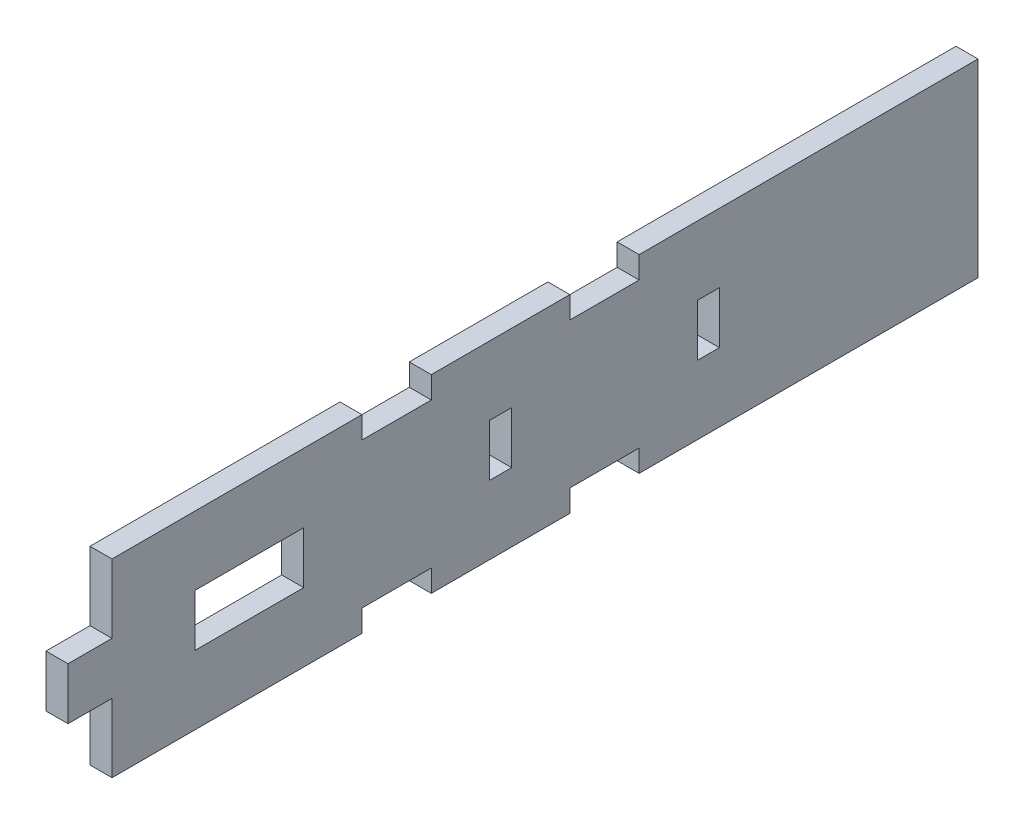
ISO-10303-21;
HEADER;
FILE_DESCRIPTION(('STEP AP214'),'2;1');
FILE_NAME('part.step','',(''),(''),'','','');
FILE_SCHEMA(('AUTOMOTIVE_DESIGN { 1 0 10303 214 1 1 1 1 }'));
ENDSEC;
DATA;
#1=APPLICATION_CONTEXT('core data for automotive mechanical design processes');
#2=APPLICATION_PROTOCOL_DEFINITION('international standard','automotive_design',2000,#1);
#3=PRODUCT_CONTEXT('',#1,'mechanical');
#4=PRODUCT('Part','Part','',(#3));
#5=PRODUCT_RELATED_PRODUCT_CATEGORY('part','',(#4));
#6=PRODUCT_DEFINITION_FORMATION('','',#4);
#7=PRODUCT_DEFINITION_CONTEXT('part definition',#1,'design');
#8=PRODUCT_DEFINITION('design','',#6,#7);
#9=PRODUCT_DEFINITION_SHAPE('','',#8);
#10=(LENGTH_UNIT() NAMED_UNIT(*) SI_UNIT(.MILLI.,.METRE.));
#11=(NAMED_UNIT(*) PLANE_ANGLE_UNIT() SI_UNIT($,.RADIAN.));
#12=(NAMED_UNIT(*) SI_UNIT($,.STERADIAN.) SOLID_ANGLE_UNIT());
#13=UNCERTAINTY_MEASURE_WITH_UNIT(LENGTH_MEASURE(1.E-05),#10,'distance_accuracy_value','');
#14=(GEOMETRIC_REPRESENTATION_CONTEXT(3) GLOBAL_UNCERTAINTY_ASSIGNED_CONTEXT((#13)) GLOBAL_UNIT_ASSIGNED_CONTEXT((#10,
#11,#12)) REPRESENTATION_CONTEXT('',''));
#15=CARTESIAN_POINT('',(0.,0.,0.));
#16=DIRECTION('',(0.,0.,1.));
#17=DIRECTION('',(1.,0.,0.));
#18=AXIS2_PLACEMENT_3D('',#15,#16,#17);
#19=CARTESIAN_POINT('',(6.35,-27.35,0.));
#20=DIRECTION('',(0.,-1.,0.));
#21=DIRECTION('',(0.,0.,-1.));
#22=AXIS2_PLACEMENT_3D('',#19,#20,#21);
#23=PLANE('',#22);
#24=DIRECTION('',(0.,0.,1.));
#25=VECTOR('',#24,1.);
#26=CARTESIAN_POINT('',(0.,-27.35,0.));
#27=LINE('',#26,#25);
#28=CARTESIAN_POINT('',(0.,-27.35,52.825));
#29=VERTEX_POINT('',#28);
#30=CARTESIAN_POINT('',(0.,-27.35,125.));
#31=VERTEX_POINT('',#30);
#32=EDGE_CURVE('E293',#29,#31,#27,.T.);
#33=ORIENTED_EDGE('',*,*,#32,.F.);
#34=DIRECTION('',(1.,0.,0.));
#35=VECTOR('',#34,1.);
#36=CARTESIAN_POINT('',(0.,-27.35,52.825));
#37=LINE('',#36,#35);
#38=CARTESIAN_POINT('',(6.35,-27.35,52.825));
#39=VERTEX_POINT('',#38);
#40=EDGE_CURVE('E274',#29,#39,#37,.T.);
#41=ORIENTED_EDGE('',*,*,#40,.T.);
#42=DIRECTION('',(0.,0.,1.));
#43=VECTOR('',#42,1.);
#44=CARTESIAN_POINT('',(6.35,-27.35,0.));
#45=LINE('',#44,#43);
#46=CARTESIAN_POINT('',(6.35,-27.35,125.));
#47=VERTEX_POINT('',#46);
#48=EDGE_CURVE('E461',#39,#47,#45,.T.);
#49=ORIENTED_EDGE('',*,*,#48,.T.);
#50=DIRECTION('',(-1.,0.,0.));
#51=VECTOR('',#50,1.);
#52=CARTESIAN_POINT('',(6.35,-27.35,125.));
#53=LINE('',#52,#51);
#54=EDGE_CURVE('E301',#47,#31,#53,.T.);
#55=ORIENTED_EDGE('',*,*,#54,.T.);
#56=EDGE_LOOP('',(#33,#41,#49,#55));
#57=FACE_BOUND('',#56,.T.);
#58=ADVANCED_FACE('F41',(#57),#23,.T.);
#59=CARTESIAN_POINT('',(6.35,-27.35,-7.17499999999997));
#60=VERTEX_POINT('',#59);
#61=CARTESIAN_POINT('',(6.35,-27.35,32.825));
#62=VERTEX_POINT('',#61);
#63=EDGE_CURVE('E459',#60,#62,#45,.T.);
#64=ORIENTED_EDGE('',*,*,#63,.T.);
#65=DIRECTION('',(1.,0.,0.));
#66=VECTOR('',#65,1.);
#67=CARTESIAN_POINT('',(0.,-27.35,32.825));
#68=LINE('',#67,#66);
#69=CARTESIAN_POINT('',(0.,-27.35,32.825));
#70=VERTEX_POINT('',#69);
#71=EDGE_CURVE('E286',#70,#62,#68,.T.);
#72=ORIENTED_EDGE('',*,*,#71,.F.);
#73=CARTESIAN_POINT('',(0.,-27.35,-7.17499999999997));
#74=VERTEX_POINT('',#73);
#75=EDGE_CURVE('E304',#74,#70,#27,.T.);
#76=ORIENTED_EDGE('',*,*,#75,.F.);
#77=DIRECTION('',(1.,0.,0.));
#78=VECTOR('',#77,1.);
#79=CARTESIAN_POINT('',(0.,-27.35,-7.17499999999997));
#80=LINE('',#79,#78);
#81=EDGE_CURVE('E577',#74,#60,#80,.T.);
#82=ORIENTED_EDGE('',*,*,#81,.T.);
#83=EDGE_LOOP('',(#64,#72,#76,#82));
#84=FACE_BOUND('',#83,.T.);
#85=ADVANCED_FACE('F438',(#84),#23,.T.);
#86=CARTESIAN_POINT('',(6.35,-27.35,-125.));
#87=VERTEX_POINT('',#86);
#88=CARTESIAN_POINT('',(6.35,-27.35,-27.175));
#89=VERTEX_POINT('',#88);
#90=EDGE_CURVE('E453',#87,#89,#45,.T.);
#91=ORIENTED_EDGE('',*,*,#90,.T.);
#92=DIRECTION('',(1.,0.,0.));
#93=VECTOR('',#92,1.);
#94=CARTESIAN_POINT('',(0.,-27.35,-27.175));
#95=LINE('',#94,#93);
#96=CARTESIAN_POINT('',(0.,-27.35,-27.175));
#97=VERTEX_POINT('',#96);
#98=EDGE_CURVE('E454',#97,#89,#95,.T.);
#99=ORIENTED_EDGE('',*,*,#98,.F.);
#100=CARTESIAN_POINT('',(0.,-27.35,-125.));
#101=VERTEX_POINT('',#100);
#102=EDGE_CURVE('E307',#101,#97,#27,.T.);
#103=ORIENTED_EDGE('',*,*,#102,.F.);
#104=DIRECTION('',(-1.,0.,0.));
#105=VECTOR('',#104,1.);
#106=CARTESIAN_POINT('',(6.35,-27.35,-125.));
#107=LINE('',#106,#105);
#108=EDGE_CURVE('E352',#87,#101,#107,.T.);
#109=ORIENTED_EDGE('',*,*,#108,.F.);
#110=EDGE_LOOP('',(#91,#99,#103,#109));
#111=FACE_BOUND('',#110,.T.);
#112=ADVANCED_FACE('F431',(#111),#23,.T.);
#113=CARTESIAN_POINT('',(6.35,0.,0.));
#114=DIRECTION('',(1.,0.,0.));
#115=DIRECTION('',(0.,0.,-1.));
#116=AXIS2_PLACEMENT_3D('',#113,#114,#115);
#117=PLANE('',#116);
#118=DIRECTION('',(0.,0.,-1.));
#119=VECTOR('',#118,1.);
#120=CARTESIAN_POINT('',(6.35,-7.5,69.65));
#121=LINE('',#120,#119);
#122=CARTESIAN_POINT('',(6.35,-7.5,101.));
#123=VERTEX_POINT('',#122);
#124=CARTESIAN_POINT('',(6.35,-7.5,69.65));
#125=VERTEX_POINT('',#124);
#126=EDGE_CURVE('E722',#123,#125,#121,.T.);
#127=ORIENTED_EDGE('',*,*,#126,.F.);
#128=DIRECTION('',(0.,-1.,0.));
#129=VECTOR('',#128,1.);
#130=CARTESIAN_POINT('',(6.35,-7.5,101.));
#131=LINE('',#130,#129);
#132=CARTESIAN_POINT('',(6.35,7.5,101.));
#133=VERTEX_POINT('',#132);
#134=EDGE_CURVE('E620',#133,#123,#131,.T.);
#135=ORIENTED_EDGE('',*,*,#134,.F.);
#136=DIRECTION('',(0.,0.,1.));
#137=VECTOR('',#136,1.);
#138=CARTESIAN_POINT('',(6.35,7.5,69.65));
#139=LINE('',#138,#137);
#140=CARTESIAN_POINT('',(6.35,7.5,69.65));
#141=VERTEX_POINT('',#140);
#142=EDGE_CURVE('E528',#141,#133,#139,.T.);
#143=ORIENTED_EDGE('',*,*,#142,.F.);
#144=DIRECTION('',(0.,1.,0.));
#145=VECTOR('',#144,1.);
#146=CARTESIAN_POINT('',(6.35,-7.5,69.65));
#147=LINE('',#146,#145);
#148=EDGE_CURVE('E735',#125,#141,#147,.T.);
#149=ORIENTED_EDGE('',*,*,#148,.F.);
#150=EDGE_LOOP('',(#127,#135,#143,#149));
#151=FACE_BOUND('',#150,.T.);
#152=DIRECTION('',(0.,-1.,0.));
#153=VECTOR('',#152,1.);
#154=CARTESIAN_POINT('',(6.35,-7.5,16.));
#155=LINE('',#154,#153);
#156=CARTESIAN_POINT('',(6.35,7.5,16.));
#157=VERTEX_POINT('',#156);
#158=CARTESIAN_POINT('',(6.35,-7.5,16.));
#159=VERTEX_POINT('',#158);
#160=EDGE_CURVE('E715',#157,#159,#155,.T.);
#161=ORIENTED_EDGE('',*,*,#160,.F.);
#162=DIRECTION('',(0.,0.,1.));
#163=VECTOR('',#162,1.);
#164=CARTESIAN_POINT('',(6.35,7.5,9.65000000000003));
#165=LINE('',#164,#163);
#166=CARTESIAN_POINT('',(6.35,7.5,9.65000000000003));
#167=VERTEX_POINT('',#166);
#168=EDGE_CURVE('E705',#167,#157,#165,.T.);
#169=ORIENTED_EDGE('',*,*,#168,.F.);
#170=DIRECTION('',(0.,1.,0.));
#171=VECTOR('',#170,1.);
#172=CARTESIAN_POINT('',(6.35,-7.5,9.65000000000003));
#173=LINE('',#172,#171);
#174=CARTESIAN_POINT('',(6.35,-7.5,9.65000000000003));
#175=VERTEX_POINT('',#174);
#176=EDGE_CURVE('E694',#175,#167,#173,.T.);
#177=ORIENTED_EDGE('',*,*,#176,.F.);
#178=DIRECTION('',(0.,0.,-1.));
#179=VECTOR('',#178,1.);
#180=CARTESIAN_POINT('',(6.35,-7.5,9.65000000000003));
#181=LINE('',#180,#179);
#182=EDGE_CURVE('E676',#159,#175,#181,.T.);
#183=ORIENTED_EDGE('',*,*,#182,.F.);
#184=EDGE_LOOP('',(#161,#169,#177,#183));
#185=FACE_BOUND('',#184,.T.);
#186=DIRECTION('',(0.,-1.,0.));
#187=VECTOR('',#186,1.);
#188=CARTESIAN_POINT('',(6.35,-7.5,-44.));
#189=LINE('',#188,#187);
#190=CARTESIAN_POINT('',(6.35,7.5,-44.));
#191=VERTEX_POINT('',#190);
#192=CARTESIAN_POINT('',(6.35,-7.5,-44.));
#193=VERTEX_POINT('',#192);
#194=EDGE_CURVE('E363',#191,#193,#189,.T.);
#195=ORIENTED_EDGE('',*,*,#194,.F.);
#196=DIRECTION('',(0.,0.,1.));
#197=VECTOR('',#196,1.);
#198=CARTESIAN_POINT('',(6.35,7.5,-50.35));
#199=LINE('',#198,#197);
#200=CARTESIAN_POINT('',(6.35,7.5,-50.35));
#201=VERTEX_POINT('',#200);
#202=EDGE_CURVE('E366',#201,#191,#199,.T.);
#203=ORIENTED_EDGE('',*,*,#202,.F.);
#204=DIRECTION('',(0.,1.,0.));
#205=VECTOR('',#204,1.);
#206=CARTESIAN_POINT('',(6.35,-7.5,-50.35));
#207=LINE('',#206,#205);
#208=CARTESIAN_POINT('',(6.35,-7.5,-50.35));
#209=VERTEX_POINT('',#208);
#210=EDGE_CURVE('E370',#209,#201,#207,.T.);
#211=ORIENTED_EDGE('',*,*,#210,.F.);
#212=DIRECTION('',(0.,0.,-1.));
#213=VECTOR('',#212,1.);
#214=CARTESIAN_POINT('',(6.35,-7.5,-50.35));
#215=LINE('',#214,#213);
#216=EDGE_CURVE('E374',#193,#209,#215,.T.);
#217=ORIENTED_EDGE('',*,*,#216,.F.);
#218=EDGE_LOOP('',(#195,#203,#211,#217));
#219=FACE_BOUND('',#218,.T.);
#220=ORIENTED_EDGE('',*,*,#48,.F.);
#221=DIRECTION('',(0.,1.,0.));
#222=VECTOR('',#221,1.);
#223=CARTESIAN_POINT('',(6.35,-21.,52.825));
#224=LINE('',#223,#222);
#225=CARTESIAN_POINT('',(6.35,-21.,52.825));
#226=VERTEX_POINT('',#225);
#227=EDGE_CURVE('E281',#39,#226,#224,.T.);
#228=ORIENTED_EDGE('',*,*,#227,.T.);
#229=DIRECTION('',(0.,0.,-1.));
#230=VECTOR('',#229,1.);
#231=CARTESIAN_POINT('',(6.35,-21.,32.825));
#232=LINE('',#231,#230);
#233=CARTESIAN_POINT('',(6.35,-21.,32.825));
#234=VERTEX_POINT('',#233);
#235=EDGE_CURVE('E298',#226,#234,#232,.T.);
#236=ORIENTED_EDGE('',*,*,#235,.T.);
#237=DIRECTION('',(0.,-1.,0.));
#238=VECTOR('',#237,1.);
#239=CARTESIAN_POINT('',(6.35,-21.,32.825));
#240=LINE('',#239,#238);
#241=EDGE_CURVE('E546',#234,#62,#240,.T.);
#242=ORIENTED_EDGE('',*,*,#241,.T.);
#243=ORIENTED_EDGE('',*,*,#63,.F.);
#244=DIRECTION('',(0.,1.,0.));
#245=VECTOR('',#244,1.);
#246=CARTESIAN_POINT('',(6.35,-21.,-7.17499999999997));
#247=LINE('',#246,#245);
#248=CARTESIAN_POINT('',(6.35,-21.,-7.17499999999997));
#249=VERTEX_POINT('',#248);
#250=EDGE_CURVE('E578',#60,#249,#247,.T.);
#251=ORIENTED_EDGE('',*,*,#250,.T.);
#252=DIRECTION('',(0.,0.,-1.));
#253=VECTOR('',#252,1.);
#254=CARTESIAN_POINT('',(6.35,-21.,-27.175));
#255=LINE('',#254,#253);
#256=CARTESIAN_POINT('',(6.35,-21.,-27.175));
#257=VERTEX_POINT('',#256);
#258=EDGE_CURVE('E571',#249,#257,#255,.T.);
#259=ORIENTED_EDGE('',*,*,#258,.T.);
#260=DIRECTION('',(0.,-1.,0.));
#261=VECTOR('',#260,1.);
#262=CARTESIAN_POINT('',(6.35,-21.,-27.175));
#263=LINE('',#262,#261);
#264=EDGE_CURVE('E582',#257,#89,#263,.T.);
#265=ORIENTED_EDGE('',*,*,#264,.T.);
#266=ORIENTED_EDGE('',*,*,#90,.F.);
#267=DIRECTION('',(0.,1.,0.));
#268=VECTOR('',#267,1.);
#269=CARTESIAN_POINT('',(6.35,0.,-125.));
#270=LINE('',#269,#268);
#271=CARTESIAN_POINT('',(6.35,27.35,-125.));
#272=VERTEX_POINT('',#271);
#273=EDGE_CURVE('E458',#87,#272,#270,.T.);
#274=ORIENTED_EDGE('',*,*,#273,.T.);
#275=DIRECTION('',(0.,0.,1.));
#276=VECTOR('',#275,1.);
#277=CARTESIAN_POINT('',(6.35,27.35,0.));
#278=LINE('',#277,#276);
#279=CARTESIAN_POINT('',(6.35,27.35,-27.175));
#280=VERTEX_POINT('',#279);
#281=EDGE_CURVE('E481',#272,#280,#278,.T.);
#282=ORIENTED_EDGE('',*,*,#281,.T.);
#283=DIRECTION('',(0.,1.,0.));
#284=VECTOR('',#283,1.);
#285=CARTESIAN_POINT('',(6.35,21.,-27.175));
#286=LINE('',#285,#284);
#287=CARTESIAN_POINT('',(6.35,21.,-27.175));
#288=VERTEX_POINT('',#287);
#289=EDGE_CURVE('E635',#288,#280,#286,.T.);
#290=ORIENTED_EDGE('',*,*,#289,.F.);
#291=DIRECTION('',(0.,0.,-1.));
#292=VECTOR('',#291,1.);
#293=CARTESIAN_POINT('',(6.35,21.,-27.175));
#294=LINE('',#293,#292);
#295=CARTESIAN_POINT('',(6.35,21.,-7.17499999999997));
#296=VERTEX_POINT('',#295);
#297=EDGE_CURVE('E647',#296,#288,#294,.T.);
#298=ORIENTED_EDGE('',*,*,#297,.F.);
#299=DIRECTION('',(0.,-1.,0.));
#300=VECTOR('',#299,1.);
#301=CARTESIAN_POINT('',(6.35,21.,-7.17499999999997));
#302=LINE('',#301,#300);
#303=CARTESIAN_POINT('',(6.35,27.35,-7.17499999999997));
#304=VERTEX_POINT('',#303);
#305=EDGE_CURVE('E562',#304,#296,#302,.T.);
#306=ORIENTED_EDGE('',*,*,#305,.F.);
#307=CARTESIAN_POINT('',(6.35,27.35,32.825));
#308=VERTEX_POINT('',#307);
#309=EDGE_CURVE('E488',#304,#308,#278,.T.);
#310=ORIENTED_EDGE('',*,*,#309,.T.);
#311=DIRECTION('',(0.,1.,0.));
#312=VECTOR('',#311,1.);
#313=CARTESIAN_POINT('',(6.35,21.,32.825));
#314=LINE('',#313,#312);
#315=CARTESIAN_POINT('',(6.35,21.,32.825));
#316=VERTEX_POINT('',#315);
#317=EDGE_CURVE('E599',#316,#308,#314,.T.);
#318=ORIENTED_EDGE('',*,*,#317,.F.);
#319=DIRECTION('',(0.,0.,-1.));
#320=VECTOR('',#319,1.);
#321=CARTESIAN_POINT('',(6.35,21.,32.825));
#322=LINE('',#321,#320);
#323=CARTESIAN_POINT('',(6.35,21.,52.825));
#324=VERTEX_POINT('',#323);
#325=EDGE_CURVE('E610',#324,#316,#322,.T.);
#326=ORIENTED_EDGE('',*,*,#325,.F.);
#327=DIRECTION('',(0.,-1.,0.));
#328=VECTOR('',#327,1.);
#329=CARTESIAN_POINT('',(6.35,21.,52.825));
#330=LINE('',#329,#328);
#331=CARTESIAN_POINT('',(6.35,27.35,52.825));
#332=VERTEX_POINT('',#331);
#333=EDGE_CURVE('E500',#332,#324,#330,.T.);
#334=ORIENTED_EDGE('',*,*,#333,.F.);
#335=CARTESIAN_POINT('',(6.35,27.35,125.));
#336=VERTEX_POINT('',#335);
#337=EDGE_CURVE('E464',#332,#336,#278,.T.);
#338=ORIENTED_EDGE('',*,*,#337,.T.);
#339=DIRECTION('',(0.,1.,0.));
#340=VECTOR('',#339,1.);
#341=CARTESIAN_POINT('',(6.35,0.,125.));
#342=LINE('',#341,#340);
#343=CARTESIAN_POINT('',(6.35,7.5,125.));
#344=VERTEX_POINT('',#343);
#345=EDGE_CURVE('E473',#344,#336,#342,.T.);
#346=ORIENTED_EDGE('',*,*,#345,.F.);
#347=DIRECTION('',(0.,0.,1.));
#348=VECTOR('',#347,1.);
#349=CARTESIAN_POINT('',(6.35,7.50000000000002,0.));
#350=LINE('',#349,#348);
#351=CARTESIAN_POINT('',(6.35,7.5,137.7));
#352=VERTEX_POINT('',#351);
#353=EDGE_CURVE('E342',#344,#352,#350,.T.);
#354=ORIENTED_EDGE('',*,*,#353,.T.);
#355=DIRECTION('',(0.,1.,0.));
#356=VECTOR('',#355,1.);
#357=CARTESIAN_POINT('',(6.35,0.,137.7));
#358=LINE('',#357,#356);
#359=CARTESIAN_POINT('',(6.35,-7.5,137.7));
#360=VERTEX_POINT('',#359);
#361=EDGE_CURVE('E337',#360,#352,#358,.T.);
#362=ORIENTED_EDGE('',*,*,#361,.F.);
#363=DIRECTION('',(0.,0.,1.));
#364=VECTOR('',#363,1.);
#365=CARTESIAN_POINT('',(6.35,-7.49999999999998,0.));
#366=LINE('',#365,#364);
#367=CARTESIAN_POINT('',(6.35,-7.5,125.));
#368=VERTEX_POINT('',#367);
#369=EDGE_CURVE('E472',#368,#360,#366,.T.);
#370=ORIENTED_EDGE('',*,*,#369,.F.);
#371=EDGE_CURVE('E469',#47,#368,#342,.T.);
#372=ORIENTED_EDGE('',*,*,#371,.F.);
#373=EDGE_LOOP('',(#220,#228,#236,#242,#243,#251,#259,#265,#266,#274,#282,#290,#298,#306,#310,
#318,#326,#334,#338,#346,#354,#362,#370,#372));
#374=FACE_BOUND('',#373,.T.);
#375=ADVANCED_FACE('F411',(#151,#185,#219,#374),#117,.T.);
#376=CARTESIAN_POINT('',(0.,0.,0.));
#377=DIRECTION('',(1.,0.,0.));
#378=DIRECTION('',(0.,0.,-1.));
#379=AXIS2_PLACEMENT_3D('',#376,#377,#378);
#380=PLANE('',#379);
#381=DIRECTION('',(0.,0.,1.));
#382=VECTOR('',#381,1.);
#383=CARTESIAN_POINT('',(0.,7.5,9.65000000000003));
#384=LINE('',#383,#382);
#385=CARTESIAN_POINT('',(0.,7.5,9.65000000000003));
#386=VERTEX_POINT('',#385);
#387=CARTESIAN_POINT('',(0.,7.5,16.));
#388=VERTEX_POINT('',#387);
#389=EDGE_CURVE('E712',#386,#388,#384,.T.);
#390=ORIENTED_EDGE('',*,*,#389,.T.);
#391=DIRECTION('',(0.,-1.,0.));
#392=VECTOR('',#391,1.);
#393=CARTESIAN_POINT('',(0.,-7.5,16.));
#394=LINE('',#393,#392);
#395=CARTESIAN_POINT('',(0.,-7.5,16.));
#396=VERTEX_POINT('',#395);
#397=EDGE_CURVE('E718',#388,#396,#394,.T.);
#398=ORIENTED_EDGE('',*,*,#397,.T.);
#399=DIRECTION('',(0.,0.,-1.));
#400=VECTOR('',#399,1.);
#401=CARTESIAN_POINT('',(0.,-7.5,9.65000000000003));
#402=LINE('',#401,#400);
#403=CARTESIAN_POINT('',(0.,-7.5,9.65000000000003));
#404=VERTEX_POINT('',#403);
#405=EDGE_CURVE('E682',#396,#404,#402,.T.);
#406=ORIENTED_EDGE('',*,*,#405,.T.);
#407=DIRECTION('',(0.,1.,0.));
#408=VECTOR('',#407,1.);
#409=CARTESIAN_POINT('',(0.,-7.5,9.65000000000003));
#410=LINE('',#409,#408);
#411=EDGE_CURVE('E701',#404,#386,#410,.T.);
#412=ORIENTED_EDGE('',*,*,#411,.T.);
#413=EDGE_LOOP('',(#390,#398,#406,#412));
#414=FACE_BOUND('',#413,.T.);
#415=DIRECTION('',(0.,-1.,0.));
#416=VECTOR('',#415,1.);
#417=CARTESIAN_POINT('',(0.,-7.5,101.));
#418=LINE('',#417,#416);
#419=CARTESIAN_POINT('',(0.,7.5,101.));
#420=VERTEX_POINT('',#419);
#421=CARTESIAN_POINT('',(0.,-7.5,101.));
#422=VERTEX_POINT('',#421);
#423=EDGE_CURVE('E664',#420,#422,#418,.T.);
#424=ORIENTED_EDGE('',*,*,#423,.T.);
#425=DIRECTION('',(0.,0.,-1.));
#426=VECTOR('',#425,1.);
#427=CARTESIAN_POINT('',(0.,-7.5,69.65));
#428=LINE('',#427,#426);
#429=CARTESIAN_POINT('',(0.,-7.5,69.65));
#430=VERTEX_POINT('',#429);
#431=EDGE_CURVE('E723',#422,#430,#428,.T.);
#432=ORIENTED_EDGE('',*,*,#431,.T.);
#433=DIRECTION('',(0.,1.,0.));
#434=VECTOR('',#433,1.);
#435=CARTESIAN_POINT('',(0.,-7.5,69.65));
#436=LINE('',#435,#434);
#437=CARTESIAN_POINT('',(0.,7.5,69.65));
#438=VERTEX_POINT('',#437);
#439=EDGE_CURVE('E727',#430,#438,#436,.T.);
#440=ORIENTED_EDGE('',*,*,#439,.T.);
#441=DIRECTION('',(0.,0.,1.));
#442=VECTOR('',#441,1.);
#443=CARTESIAN_POINT('',(0.,7.5,69.65));
#444=LINE('',#443,#442);
#445=EDGE_CURVE('E525',#438,#420,#444,.T.);
#446=ORIENTED_EDGE('',*,*,#445,.T.);
#447=EDGE_LOOP('',(#424,#432,#440,#446));
#448=FACE_BOUND('',#447,.T.);
#449=DIRECTION('',(0.,-1.,0.));
#450=VECTOR('',#449,1.);
#451=CARTESIAN_POINT('',(0.,-7.5,-44.));
#452=LINE('',#451,#450);
#453=CARTESIAN_POINT('',(0.,7.5,-44.));
#454=VERTEX_POINT('',#453);
#455=CARTESIAN_POINT('',(0.,-7.5,-44.));
#456=VERTEX_POINT('',#455);
#457=EDGE_CURVE('E378',#454,#456,#452,.T.);
#458=ORIENTED_EDGE('',*,*,#457,.T.);
#459=DIRECTION('',(0.,0.,-1.));
#460=VECTOR('',#459,1.);
#461=CARTESIAN_POINT('',(0.,-7.5,-50.35));
#462=LINE('',#461,#460);
#463=CARTESIAN_POINT('',(0.,-7.5,-50.35));
#464=VERTEX_POINT('',#463);
#465=EDGE_CURVE('E381',#456,#464,#462,.T.);
#466=ORIENTED_EDGE('',*,*,#465,.T.);
#467=DIRECTION('',(0.,1.,0.));
#468=VECTOR('',#467,1.);
#469=CARTESIAN_POINT('',(0.,-7.5,-50.35));
#470=LINE('',#469,#468);
#471=CARTESIAN_POINT('',(0.,7.5,-50.35));
#472=VERTEX_POINT('',#471);
#473=EDGE_CURVE('E384',#464,#472,#470,.T.);
#474=ORIENTED_EDGE('',*,*,#473,.T.);
#475=DIRECTION('',(0.,0.,1.));
#476=VECTOR('',#475,1.);
#477=CARTESIAN_POINT('',(0.,7.5,-50.35));
#478=LINE('',#477,#476);
#479=EDGE_CURVE('E387',#472,#454,#478,.T.);
#480=ORIENTED_EDGE('',*,*,#479,.T.);
#481=EDGE_LOOP('',(#458,#466,#474,#480));
#482=FACE_BOUND('',#481,.T.);
#483=DIRECTION('',(0.,1.,0.));
#484=VECTOR('',#483,1.);
#485=CARTESIAN_POINT('',(0.,-21.,52.825));
#486=LINE('',#485,#484);
#487=CARTESIAN_POINT('',(0.,-21.,52.825));
#488=VERTEX_POINT('',#487);
#489=EDGE_CURVE('E278',#29,#488,#486,.T.);
#490=ORIENTED_EDGE('',*,*,#489,.F.);
#491=ORIENTED_EDGE('',*,*,#32,.T.);
#492=DIRECTION('',(0.,1.,0.));
#493=VECTOR('',#492,1.);
#494=CARTESIAN_POINT('',(0.,0.,125.));
#495=LINE('',#494,#493);
#496=CARTESIAN_POINT('',(0.,-7.5,125.));
#497=VERTEX_POINT('',#496);
#498=EDGE_CURVE('E305',#31,#497,#495,.T.);
#499=ORIENTED_EDGE('',*,*,#498,.T.);
#500=DIRECTION('',(0.,0.,1.));
#501=VECTOR('',#500,1.);
#502=CARTESIAN_POINT('',(0.,-7.49999999999998,0.));
#503=LINE('',#502,#501);
#504=CARTESIAN_POINT('',(0.,-7.5,137.7));
#505=VERTEX_POINT('',#504);
#506=EDGE_CURVE('E311',#497,#505,#503,.T.);
#507=ORIENTED_EDGE('',*,*,#506,.T.);
#508=DIRECTION('',(0.,1.,0.));
#509=VECTOR('',#508,1.);
#510=CARTESIAN_POINT('',(0.,0.,137.7));
#511=LINE('',#510,#509);
#512=CARTESIAN_POINT('',(0.,7.5,137.7));
#513=VERTEX_POINT('',#512);
#514=EDGE_CURVE('E514',#505,#513,#511,.T.);
#515=ORIENTED_EDGE('',*,*,#514,.T.);
#516=DIRECTION('',(0.,0.,1.));
#517=VECTOR('',#516,1.);
#518=CARTESIAN_POINT('',(0.,7.50000000000002,0.));
#519=LINE('',#518,#517);
#520=CARTESIAN_POINT('',(0.,7.5,125.));
#521=VERTEX_POINT('',#520);
#522=EDGE_CURVE('E333',#521,#513,#519,.T.);
#523=ORIENTED_EDGE('',*,*,#522,.F.);
#524=CARTESIAN_POINT('',(0.,27.35,125.));
#525=VERTEX_POINT('',#524);
#526=EDGE_CURVE('E313',#521,#525,#495,.T.);
#527=ORIENTED_EDGE('',*,*,#526,.T.);
#528=DIRECTION('',(0.,0.,1.));
#529=VECTOR('',#528,1.);
#530=CARTESIAN_POINT('',(0.,27.35,0.));
#531=LINE('',#530,#529);
#532=CARTESIAN_POINT('',(0.,27.35,52.825));
#533=VERTEX_POINT('',#532);
#534=EDGE_CURVE('E322',#533,#525,#531,.T.);
#535=ORIENTED_EDGE('',*,*,#534,.F.);
#536=DIRECTION('',(0.,-1.,0.));
#537=VECTOR('',#536,1.);
#538=CARTESIAN_POINT('',(0.,21.,52.825));
#539=LINE('',#538,#537);
#540=CARTESIAN_POINT('',(0.,21.,52.825));
#541=VERTEX_POINT('',#540);
#542=EDGE_CURVE('E595',#533,#541,#539,.T.);
#543=ORIENTED_EDGE('',*,*,#542,.T.);
#544=DIRECTION('',(0.,0.,-1.));
#545=VECTOR('',#544,1.);
#546=CARTESIAN_POINT('',(0.,21.,32.825));
#547=LINE('',#546,#545);
#548=CARTESIAN_POINT('',(0.,21.,32.825));
#549=VERTEX_POINT('',#548);
#550=EDGE_CURVE('E598',#541,#549,#547,.T.);
#551=ORIENTED_EDGE('',*,*,#550,.T.);
#552=DIRECTION('',(0.,1.,0.));
#553=VECTOR('',#552,1.);
#554=CARTESIAN_POINT('',(0.,21.,32.825));
#555=LINE('',#554,#553);
#556=CARTESIAN_POINT('',(0.,27.35,32.825));
#557=VERTEX_POINT('',#556);
#558=EDGE_CURVE('E603',#549,#557,#555,.T.);
#559=ORIENTED_EDGE('',*,*,#558,.T.);
#560=CARTESIAN_POINT('',(0.,27.35,-7.17499999999997));
#561=VERTEX_POINT('',#560);
#562=EDGE_CURVE('E327',#561,#557,#531,.T.);
#563=ORIENTED_EDGE('',*,*,#562,.F.);
#564=DIRECTION('',(0.,-1.,0.));
#565=VECTOR('',#564,1.);
#566=CARTESIAN_POINT('',(0.,21.,-7.17499999999997));
#567=LINE('',#566,#565);
#568=CARTESIAN_POINT('',(0.,21.,-7.17499999999997));
#569=VERTEX_POINT('',#568);
#570=EDGE_CURVE('E630',#561,#569,#567,.T.);
#571=ORIENTED_EDGE('',*,*,#570,.T.);
#572=DIRECTION('',(0.,0.,-1.));
#573=VECTOR('',#572,1.);
#574=CARTESIAN_POINT('',(0.,21.,-27.175));
#575=LINE('',#574,#573);
#576=CARTESIAN_POINT('',(0.,21.,-27.175));
#577=VERTEX_POINT('',#576);
#578=EDGE_CURVE('E634',#569,#577,#575,.T.);
#579=ORIENTED_EDGE('',*,*,#578,.T.);
#580=DIRECTION('',(0.,1.,0.));
#581=VECTOR('',#580,1.);
#582=CARTESIAN_POINT('',(0.,21.,-27.175));
#583=LINE('',#582,#581);
#584=CARTESIAN_POINT('',(0.,27.35,-27.175));
#585=VERTEX_POINT('',#584);
#586=EDGE_CURVE('E639',#577,#585,#583,.T.);
#587=ORIENTED_EDGE('',*,*,#586,.T.);
#588=CARTESIAN_POINT('',(0.,27.35,-125.));
#589=VERTEX_POINT('',#588);
#590=EDGE_CURVE('E329',#589,#585,#531,.T.);
#591=ORIENTED_EDGE('',*,*,#590,.F.);
#592=DIRECTION('',(0.,1.,0.));
#593=VECTOR('',#592,1.);
#594=CARTESIAN_POINT('',(0.,0.,-125.));
#595=LINE('',#594,#593);
#596=EDGE_CURVE('E317',#101,#589,#595,.T.);
#597=ORIENTED_EDGE('',*,*,#596,.F.);
#598=ORIENTED_EDGE('',*,*,#102,.T.);
#599=DIRECTION('',(0.,-1.,0.));
#600=VECTOR('',#599,1.);
#601=CARTESIAN_POINT('',(0.,-21.,-27.175));
#602=LINE('',#601,#600);
#603=CARTESIAN_POINT('',(0.,-21.,-27.175));
#604=VERTEX_POINT('',#603);
#605=EDGE_CURVE('E570',#604,#97,#602,.T.);
#606=ORIENTED_EDGE('',*,*,#605,.F.);
#607=DIRECTION('',(0.,0.,-1.));
#608=VECTOR('',#607,1.);
#609=CARTESIAN_POINT('',(0.,-21.,-27.175));
#610=LINE('',#609,#608);
#611=CARTESIAN_POINT('',(0.,-21.,-7.17499999999997));
#612=VERTEX_POINT('',#611);
#613=EDGE_CURVE('E574',#612,#604,#610,.T.);
#614=ORIENTED_EDGE('',*,*,#613,.F.);
#615=DIRECTION('',(0.,1.,0.));
#616=VECTOR('',#615,1.);
#617=CARTESIAN_POINT('',(0.,-21.,-7.17499999999997));
#618=LINE('',#617,#616);
#619=EDGE_CURVE('E567',#74,#612,#618,.T.);
#620=ORIENTED_EDGE('',*,*,#619,.F.);
#621=ORIENTED_EDGE('',*,*,#75,.T.);
#622=DIRECTION('',(0.,-1.,0.));
#623=VECTOR('',#622,1.);
#624=CARTESIAN_POINT('',(0.,-21.,32.825));
#625=LINE('',#624,#623);
#626=CARTESIAN_POINT('',(0.,-21.,32.825));
#627=VERTEX_POINT('',#626);
#628=EDGE_CURVE('E297',#627,#70,#625,.T.);
#629=ORIENTED_EDGE('',*,*,#628,.F.);
#630=DIRECTION('',(0.,0.,-1.));
#631=VECTOR('',#630,1.);
#632=CARTESIAN_POINT('',(0.,-21.,32.825));
#633=LINE('',#632,#631);
#634=EDGE_CURVE('E287',#488,#627,#633,.T.);
#635=ORIENTED_EDGE('',*,*,#634,.F.);
#636=EDGE_LOOP('',(#490,#491,#499,#507,#515,#523,#527,#535,#543,#551,#559,#563,#571,#579,#587,
#591,#597,#598,#606,#614,#620,#621,#629,#635));
#637=FACE_BOUND('',#636,.T.);
#638=ADVANCED_FACE('F291',(#414,#448,#482,#637),#380,.F.);
#639=CARTESIAN_POINT('',(6.35,27.35,0.));
#640=DIRECTION('',(0.,-1.,0.));
#641=DIRECTION('',(0.,0.,-1.));
#642=AXIS2_PLACEMENT_3D('',#639,#640,#641);
#643=PLANE('',#642);
#644=ORIENTED_EDGE('',*,*,#337,.F.);
#645=DIRECTION('',(1.,0.,0.));
#646=VECTOR('',#645,1.);
#647=CARTESIAN_POINT('',(0.,27.35,52.825));
#648=LINE('',#647,#646);
#649=EDGE_CURVE('E617',#533,#332,#648,.T.);
#650=ORIENTED_EDGE('',*,*,#649,.F.);
#651=ORIENTED_EDGE('',*,*,#534,.T.);
#652=DIRECTION('',(-1.,0.,0.));
#653=VECTOR('',#652,1.);
#654=CARTESIAN_POINT('',(6.35,27.35,125.));
#655=LINE('',#654,#653);
#656=EDGE_CURVE('E345',#336,#525,#655,.T.);
#657=ORIENTED_EDGE('',*,*,#656,.F.);
#658=EDGE_LOOP('',(#644,#650,#651,#657));
#659=FACE_BOUND('',#658,.T.);
#660=ADVANCED_FACE('F420',(#659),#643,.F.);
#661=ORIENTED_EDGE('',*,*,#562,.T.);
#662=DIRECTION('',(1.,0.,0.));
#663=VECTOR('',#662,1.);
#664=CARTESIAN_POINT('',(0.,27.35,32.825));
#665=LINE('',#664,#663);
#666=EDGE_CURVE('E621',#557,#308,#665,.T.);
#667=ORIENTED_EDGE('',*,*,#666,.T.);
#668=ORIENTED_EDGE('',*,*,#309,.F.);
#669=DIRECTION('',(1.,0.,0.));
#670=VECTOR('',#669,1.);
#671=CARTESIAN_POINT('',(0.,27.35,-7.17499999999997));
#672=LINE('',#671,#670);
#673=EDGE_CURVE('E611',#561,#304,#672,.T.);
#674=ORIENTED_EDGE('',*,*,#673,.F.);
#675=EDGE_LOOP('',(#661,#667,#668,#674));
#676=FACE_BOUND('',#675,.T.);
#677=ADVANCED_FACE('F427',(#676),#643,.F.);
#678=CARTESIAN_POINT('',(0.,-7.5,-50.35));
#679=DIRECTION('',(0.,-1.,0.));
#680=DIRECTION('',(0.,0.,-1.));
#681=AXIS2_PLACEMENT_3D('',#678,#679,#680);
#682=PLANE('',#681);
#683=ORIENTED_EDGE('',*,*,#216,.T.);
#684=DIRECTION('',(1.,0.,0.));
#685=VECTOR('',#684,1.);
#686=CARTESIAN_POINT('',(0.,-7.5,-50.35));
#687=LINE('',#686,#685);
#688=EDGE_CURVE('E11',#464,#209,#687,.T.);
#689=ORIENTED_EDGE('',*,*,#688,.F.);
#690=ORIENTED_EDGE('',*,*,#465,.F.);
#691=DIRECTION('',(1.,0.,0.));
#692=VECTOR('',#691,1.);
#693=CARTESIAN_POINT('',(0.,-7.5,-44.));
#694=LINE('',#693,#692);
#695=EDGE_CURVE('E391',#456,#193,#694,.T.);
#696=ORIENTED_EDGE('',*,*,#695,.T.);
#697=EDGE_LOOP('',(#683,#689,#690,#696));
#698=FACE_BOUND('',#697,.T.);
#699=ADVANCED_FACE('F43',(#698),#682,.F.);
#700=CARTESIAN_POINT('',(0.,-7.5,-50.35));
#701=DIRECTION('',(0.,0.,-1.));
#702=DIRECTION('',(-1.,0.,0.));
#703=AXIS2_PLACEMENT_3D('',#700,#701,#702);
#704=PLANE('',#703);
#705=ORIENTED_EDGE('',*,*,#210,.T.);
#706=DIRECTION('',(1.,0.,0.));
#707=VECTOR('',#706,1.);
#708=CARTESIAN_POINT('',(0.,7.5,-50.35));
#709=LINE('',#708,#707);
#710=EDGE_CURVE('E50',#472,#201,#709,.T.);
#711=ORIENTED_EDGE('',*,*,#710,.F.);
#712=ORIENTED_EDGE('',*,*,#473,.F.);
#713=ORIENTED_EDGE('',*,*,#688,.T.);
#714=EDGE_LOOP('',(#705,#711,#712,#713));
#715=FACE_BOUND('',#714,.T.);
#716=ADVANCED_FACE('F407',(#715),#704,.F.);
#717=CARTESIAN_POINT('',(0.,7.5,-50.35));
#718=DIRECTION('',(0.,1.,0.));
#719=DIRECTION('',(0.,0.,1.));
#720=AXIS2_PLACEMENT_3D('',#717,#718,#719);
#721=PLANE('',#720);
#722=ORIENTED_EDGE('',*,*,#202,.T.);
#723=DIRECTION('',(1.,0.,0.));
#724=VECTOR('',#723,1.);
#725=CARTESIAN_POINT('',(0.,7.5,-44.));
#726=LINE('',#725,#724);
#727=EDGE_CURVE('E395',#454,#191,#726,.T.);
#728=ORIENTED_EDGE('',*,*,#727,.F.);
#729=ORIENTED_EDGE('',*,*,#479,.F.);
#730=ORIENTED_EDGE('',*,*,#710,.T.);
#731=EDGE_LOOP('',(#722,#728,#729,#730));
#732=FACE_BOUND('',#731,.T.);
#733=ADVANCED_FACE('F403',(#732),#721,.F.);
#734=CARTESIAN_POINT('',(0.,-7.5,-44.));
#735=DIRECTION('',(0.,0.,1.));
#736=DIRECTION('',(1.,0.,0.));
#737=AXIS2_PLACEMENT_3D('',#734,#735,#736);
#738=PLANE('',#737);
#739=ORIENTED_EDGE('',*,*,#194,.T.);
#740=ORIENTED_EDGE('',*,*,#695,.F.);
#741=ORIENTED_EDGE('',*,*,#457,.F.);
#742=ORIENTED_EDGE('',*,*,#727,.T.);
#743=EDGE_LOOP('',(#739,#740,#741,#742));
#744=FACE_BOUND('',#743,.T.);
#745=ADVANCED_FACE('F417',(#744),#738,.F.);
#746=CARTESIAN_POINT('',(6.35,0.,137.7));
#747=DIRECTION('',(0.,0.,1.));
#748=DIRECTION('',(1.,0.,0.));
#749=AXIS2_PLACEMENT_3D('',#746,#747,#748);
#750=PLANE('',#749);
#751=ORIENTED_EDGE('',*,*,#514,.F.);
#752=DIRECTION('',(-1.,0.,0.));
#753=VECTOR('',#752,1.);
#754=CARTESIAN_POINT('',(6.35,-7.5,137.7));
#755=LINE('',#754,#753);
#756=EDGE_CURVE('E360',#360,#505,#755,.T.);
#757=ORIENTED_EDGE('',*,*,#756,.F.);
#758=ORIENTED_EDGE('',*,*,#361,.T.);
#759=DIRECTION('',(-1.,0.,0.));
#760=VECTOR('',#759,1.);
#761=CARTESIAN_POINT('',(6.35,7.5,137.7));
#762=LINE('',#761,#760);
#763=EDGE_CURVE('E338',#352,#513,#762,.T.);
#764=ORIENTED_EDGE('',*,*,#763,.T.);
#765=EDGE_LOOP('',(#751,#757,#758,#764));
#766=FACE_BOUND('',#765,.T.);
#767=ADVANCED_FACE('F535',(#766),#750,.T.);
#768=CARTESIAN_POINT('',(6.35,-7.49999999999998,0.));
#769=DIRECTION('',(0.,-1.,0.));
#770=DIRECTION('',(0.,0.,-1.));
#771=AXIS2_PLACEMENT_3D('',#768,#769,#770);
#772=PLANE('',#771);
#773=ORIENTED_EDGE('',*,*,#506,.F.);
#774=DIRECTION('',(-1.,0.,0.));
#775=VECTOR('',#774,1.);
#776=CARTESIAN_POINT('',(6.35,-7.5,125.));
#777=LINE('',#776,#775);
#778=EDGE_CURVE('E357',#368,#497,#777,.T.);
#779=ORIENTED_EDGE('',*,*,#778,.F.);
#780=ORIENTED_EDGE('',*,*,#369,.T.);
#781=ORIENTED_EDGE('',*,*,#756,.T.);
#782=EDGE_LOOP('',(#773,#779,#780,#781));
#783=FACE_BOUND('',#782,.T.);
#784=ADVANCED_FACE('F541',(#783),#772,.T.);
#785=CARTESIAN_POINT('',(6.35,0.,125.));
#786=DIRECTION('',(0.,0.,1.));
#787=DIRECTION('',(1.,0.,0.));
#788=AXIS2_PLACEMENT_3D('',#785,#786,#787);
#789=PLANE('',#788);
#790=ORIENTED_EDGE('',*,*,#498,.F.);
#791=ORIENTED_EDGE('',*,*,#54,.F.);
#792=ORIENTED_EDGE('',*,*,#371,.T.);
#793=ORIENTED_EDGE('',*,*,#778,.T.);
#794=EDGE_LOOP('',(#790,#791,#792,#793));
#795=FACE_BOUND('',#794,.T.);
#796=ADVANCED_FACE('F542',(#795),#789,.T.);
#797=CARTESIAN_POINT('',(6.35,0.,-125.));
#798=DIRECTION('',(0.,0.,1.));
#799=DIRECTION('',(1.,0.,0.));
#800=AXIS2_PLACEMENT_3D('',#797,#798,#799);
#801=PLANE('',#800);
#802=ORIENTED_EDGE('',*,*,#596,.T.);
#803=DIRECTION('',(-1.,0.,0.));
#804=VECTOR('',#803,1.);
#805=CARTESIAN_POINT('',(6.35,27.35,-125.));
#806=LINE('',#805,#804);
#807=EDGE_CURVE('E349',#272,#589,#806,.T.);
#808=ORIENTED_EDGE('',*,*,#807,.F.);
#809=ORIENTED_EDGE('',*,*,#273,.F.);
#810=ORIENTED_EDGE('',*,*,#108,.T.);
#811=EDGE_LOOP('',(#802,#808,#809,#810));
#812=FACE_BOUND('',#811,.T.);
#813=ADVANCED_FACE('F1028',(#812),#801,.F.);
#814=ORIENTED_EDGE('',*,*,#590,.T.);
#815=DIRECTION('',(1.,0.,0.));
#816=VECTOR('',#815,1.);
#817=CARTESIAN_POINT('',(0.,27.35,-27.175));
#818=LINE('',#817,#816);
#819=EDGE_CURVE('E655',#585,#280,#818,.T.);
#820=ORIENTED_EDGE('',*,*,#819,.T.);
#821=ORIENTED_EDGE('',*,*,#281,.F.);
#822=ORIENTED_EDGE('',*,*,#807,.T.);
#823=EDGE_LOOP('',(#814,#820,#821,#822));
#824=FACE_BOUND('',#823,.T.);
#825=ADVANCED_FACE('F430',(#824),#643,.F.);
#826=ORIENTED_EDGE('',*,*,#526,.F.);
#827=DIRECTION('',(-1.,0.,0.));
#828=VECTOR('',#827,1.);
#829=CARTESIAN_POINT('',(6.35,7.5,125.));
#830=LINE('',#829,#828);
#831=EDGE_CURVE('E341',#344,#521,#830,.T.);
#832=ORIENTED_EDGE('',*,*,#831,.F.);
#833=ORIENTED_EDGE('',*,*,#345,.T.);
#834=ORIENTED_EDGE('',*,*,#656,.T.);
#835=EDGE_LOOP('',(#826,#832,#833,#834));
#836=FACE_BOUND('',#835,.T.);
#837=ADVANCED_FACE('F505',(#836),#789,.T.);
#838=CARTESIAN_POINT('',(6.35,7.50000000000002,0.));
#839=DIRECTION('',(0.,-1.,0.));
#840=DIRECTION('',(0.,0.,-1.));
#841=AXIS2_PLACEMENT_3D('',#838,#839,#840);
#842=PLANE('',#841);
#843=ORIENTED_EDGE('',*,*,#522,.T.);
#844=ORIENTED_EDGE('',*,*,#763,.F.);
#845=ORIENTED_EDGE('',*,*,#353,.F.);
#846=ORIENTED_EDGE('',*,*,#831,.T.);
#847=EDGE_LOOP('',(#843,#844,#845,#846));
#848=FACE_BOUND('',#847,.T.);
#849=ADVANCED_FACE('F761',(#848),#842,.F.);
#850=CARTESIAN_POINT('',(0.,7.5,69.65));
#851=DIRECTION('',(0.,1.,0.));
#852=DIRECTION('',(0.,0.,1.));
#853=AXIS2_PLACEMENT_3D('',#850,#851,#852);
#854=PLANE('',#853);
#855=ORIENTED_EDGE('',*,*,#142,.T.);
#856=DIRECTION('',(1.,0.,0.));
#857=VECTOR('',#856,1.);
#858=CARTESIAN_POINT('',(0.,7.5,101.));
#859=LINE('',#858,#857);
#860=EDGE_CURVE('E668',#420,#133,#859,.T.);
#861=ORIENTED_EDGE('',*,*,#860,.F.);
#862=ORIENTED_EDGE('',*,*,#445,.F.);
#863=DIRECTION('',(1.,0.,0.));
#864=VECTOR('',#863,1.);
#865=CARTESIAN_POINT('',(0.,7.5,69.65));
#866=LINE('',#865,#864);
#867=EDGE_CURVE('E516',#438,#141,#866,.T.);
#868=ORIENTED_EDGE('',*,*,#867,.T.);
#869=EDGE_LOOP('',(#855,#861,#862,#868));
#870=FACE_BOUND('',#869,.T.);
#871=ADVANCED_FACE('F742',(#870),#854,.F.);
#872=CARTESIAN_POINT('',(0.,-7.5,69.65));
#873=DIRECTION('',(0.,0.,-1.));
#874=DIRECTION('',(-1.,0.,0.));
#875=AXIS2_PLACEMENT_3D('',#872,#873,#874);
#876=PLANE('',#875);
#877=ORIENTED_EDGE('',*,*,#148,.T.);
#878=ORIENTED_EDGE('',*,*,#867,.F.);
#879=ORIENTED_EDGE('',*,*,#439,.F.);
#880=DIRECTION('',(1.,0.,0.));
#881=VECTOR('',#880,1.);
#882=CARTESIAN_POINT('',(0.,-7.5,69.65));
#883=LINE('',#882,#881);
#884=EDGE_CURVE('E519',#430,#125,#883,.T.);
#885=ORIENTED_EDGE('',*,*,#884,.T.);
#886=EDGE_LOOP('',(#877,#878,#879,#885));
#887=FACE_BOUND('',#886,.T.);
#888=ADVANCED_FACE('F752',(#887),#876,.F.);
#889=CARTESIAN_POINT('',(0.,-7.5,69.65));
#890=DIRECTION('',(0.,-1.,0.));
#891=DIRECTION('',(0.,0.,-1.));
#892=AXIS2_PLACEMENT_3D('',#889,#890,#891);
#893=PLANE('',#892);
#894=ORIENTED_EDGE('',*,*,#126,.T.);
#895=ORIENTED_EDGE('',*,*,#884,.F.);
#896=ORIENTED_EDGE('',*,*,#431,.F.);
#897=DIRECTION('',(1.,0.,0.));
#898=VECTOR('',#897,1.);
#899=CARTESIAN_POINT('',(0.,-7.5,101.));
#900=LINE('',#899,#898);
#901=EDGE_CURVE('E672',#422,#123,#900,.T.);
#902=ORIENTED_EDGE('',*,*,#901,.T.);
#903=EDGE_LOOP('',(#894,#895,#896,#902));
#904=FACE_BOUND('',#903,.T.);
#905=ADVANCED_FACE('F751',(#904),#893,.F.);
#906=CARTESIAN_POINT('',(0.,-7.5,16.));
#907=DIRECTION('',(0.,0.,1.));
#908=DIRECTION('',(1.,0.,0.));
#909=AXIS2_PLACEMENT_3D('',#906,#907,#908);
#910=PLANE('',#909);
#911=ORIENTED_EDGE('',*,*,#160,.T.);
#912=DIRECTION('',(1.,0.,0.));
#913=VECTOR('',#912,1.);
#914=CARTESIAN_POINT('',(0.,-7.5,16.));
#915=LINE('',#914,#913);
#916=EDGE_CURVE('E690',#396,#159,#915,.T.);
#917=ORIENTED_EDGE('',*,*,#916,.F.);
#918=ORIENTED_EDGE('',*,*,#397,.F.);
#919=DIRECTION('',(1.,0.,0.));
#920=VECTOR('',#919,1.);
#921=CARTESIAN_POINT('',(0.,7.5,16.));
#922=LINE('',#921,#920);
#923=EDGE_CURVE('E708',#388,#157,#922,.T.);
#924=ORIENTED_EDGE('',*,*,#923,.T.);
#925=EDGE_LOOP('',(#911,#917,#918,#924));
#926=FACE_BOUND('',#925,.T.);
#927=ADVANCED_FACE('F759',(#926),#910,.F.);
#928=CARTESIAN_POINT('',(0.,7.5,9.65000000000003));
#929=DIRECTION('',(0.,1.,0.));
#930=DIRECTION('',(0.,0.,1.));
#931=AXIS2_PLACEMENT_3D('',#928,#929,#930);
#932=PLANE('',#931);
#933=ORIENTED_EDGE('',*,*,#168,.T.);
#934=ORIENTED_EDGE('',*,*,#923,.F.);
#935=ORIENTED_EDGE('',*,*,#389,.F.);
#936=DIRECTION('',(1.,0.,0.));
#937=VECTOR('',#936,1.);
#938=CARTESIAN_POINT('',(0.,7.5,9.65000000000003));
#939=LINE('',#938,#937);
#940=EDGE_CURVE('E697',#386,#167,#939,.T.);
#941=ORIENTED_EDGE('',*,*,#940,.T.);
#942=EDGE_LOOP('',(#933,#934,#935,#941));
#943=FACE_BOUND('',#942,.T.);
#944=ADVANCED_FACE('F766',(#943),#932,.F.);
#945=CARTESIAN_POINT('',(0.,-7.5,9.65000000000003));
#946=DIRECTION('',(0.,0.,-1.));
#947=DIRECTION('',(-1.,0.,0.));
#948=AXIS2_PLACEMENT_3D('',#945,#946,#947);
#949=PLANE('',#948);
#950=ORIENTED_EDGE('',*,*,#176,.T.);
#951=ORIENTED_EDGE('',*,*,#940,.F.);
#952=ORIENTED_EDGE('',*,*,#411,.F.);
#953=DIRECTION('',(1.,0.,0.));
#954=VECTOR('',#953,1.);
#955=CARTESIAN_POINT('',(0.,-7.5,9.65000000000003));
#956=LINE('',#955,#954);
#957=EDGE_CURVE('E686',#404,#175,#956,.T.);
#958=ORIENTED_EDGE('',*,*,#957,.T.);
#959=EDGE_LOOP('',(#950,#951,#952,#958));
#960=FACE_BOUND('',#959,.T.);
#961=ADVANCED_FACE('F770',(#960),#949,.F.);
#962=CARTESIAN_POINT('',(0.,-7.5,9.65000000000003));
#963=DIRECTION('',(0.,-1.,0.));
#964=DIRECTION('',(0.,0.,-1.));
#965=AXIS2_PLACEMENT_3D('',#962,#963,#964);
#966=PLANE('',#965);
#967=ORIENTED_EDGE('',*,*,#182,.T.);
#968=ORIENTED_EDGE('',*,*,#957,.F.);
#969=ORIENTED_EDGE('',*,*,#405,.F.);
#970=ORIENTED_EDGE('',*,*,#916,.T.);
#971=EDGE_LOOP('',(#967,#968,#969,#970));
#972=FACE_BOUND('',#971,.T.);
#973=ADVANCED_FACE('F774',(#972),#966,.F.);
#974=CARTESIAN_POINT('',(0.,-7.5,101.));
#975=DIRECTION('',(0.,0.,1.));
#976=DIRECTION('',(1.,0.,0.));
#977=AXIS2_PLACEMENT_3D('',#974,#975,#976);
#978=PLANE('',#977);
#979=ORIENTED_EDGE('',*,*,#134,.T.);
#980=ORIENTED_EDGE('',*,*,#901,.F.);
#981=ORIENTED_EDGE('',*,*,#423,.F.);
#982=ORIENTED_EDGE('',*,*,#860,.T.);
#983=EDGE_LOOP('',(#979,#980,#981,#982));
#984=FACE_BOUND('',#983,.T.);
#985=ADVANCED_FACE('F746',(#984),#978,.F.);
#986=CARTESIAN_POINT('',(0.,21.,-7.17499999999997));
#987=DIRECTION('',(0.,0.,1.));
#988=DIRECTION('',(1.,0.,0.));
#989=AXIS2_PLACEMENT_3D('',#986,#987,#988);
#990=PLANE('',#989);
#991=ORIENTED_EDGE('',*,*,#305,.T.);
#992=DIRECTION('',(1.,0.,0.));
#993=VECTOR('',#992,1.);
#994=CARTESIAN_POINT('',(0.,21.,-7.17499999999997));
#995=LINE('',#994,#993);
#996=EDGE_CURVE('E643',#569,#296,#995,.T.);
#997=ORIENTED_EDGE('',*,*,#996,.F.);
#998=ORIENTED_EDGE('',*,*,#570,.F.);
#999=ORIENTED_EDGE('',*,*,#673,.T.);
#1000=EDGE_LOOP('',(#991,#997,#998,#999));
#1001=FACE_BOUND('',#1000,.T.);
#1002=ADVANCED_FACE('F781',(#1001),#990,.F.);
#1003=CARTESIAN_POINT('',(0.,21.,-27.175));
#1004=DIRECTION('',(0.,0.,-1.));
#1005=DIRECTION('',(-1.,0.,0.));
#1006=AXIS2_PLACEMENT_3D('',#1003,#1004,#1005);
#1007=PLANE('',#1006);
#1008=ORIENTED_EDGE('',*,*,#289,.T.);
#1009=ORIENTED_EDGE('',*,*,#819,.F.);
#1010=ORIENTED_EDGE('',*,*,#586,.F.);
#1011=DIRECTION('',(1.,0.,0.));
#1012=VECTOR('',#1011,1.);
#1013=CARTESIAN_POINT('',(0.,21.,-27.175));
#1014=LINE('',#1013,#1012);
#1015=EDGE_CURVE('E659',#577,#288,#1014,.T.);
#1016=ORIENTED_EDGE('',*,*,#1015,.T.);
#1017=EDGE_LOOP('',(#1008,#1009,#1010,#1016));
#1018=FACE_BOUND('',#1017,.T.);
#1019=ADVANCED_FACE('F784',(#1018),#1007,.F.);
#1020=CARTESIAN_POINT('',(0.,21.,-27.175));
#1021=DIRECTION('',(0.,-1.,0.));
#1022=DIRECTION('',(0.,0.,-1.));
#1023=AXIS2_PLACEMENT_3D('',#1020,#1021,#1022);
#1024=PLANE('',#1023);
#1025=ORIENTED_EDGE('',*,*,#297,.T.);
#1026=ORIENTED_EDGE('',*,*,#1015,.F.);
#1027=ORIENTED_EDGE('',*,*,#578,.F.);
#1028=ORIENTED_EDGE('',*,*,#996,.T.);
#1029=EDGE_LOOP('',(#1025,#1026,#1027,#1028));
#1030=FACE_BOUND('',#1029,.T.);
#1031=ADVANCED_FACE('F786',(#1030),#1024,.F.);
#1032=CARTESIAN_POINT('',(0.,21.,52.825));
#1033=DIRECTION('',(0.,0.,1.));
#1034=DIRECTION('',(1.,0.,0.));
#1035=AXIS2_PLACEMENT_3D('',#1032,#1033,#1034);
#1036=PLANE('',#1035);
#1037=ORIENTED_EDGE('',*,*,#333,.T.);
#1038=DIRECTION('',(1.,0.,0.));
#1039=VECTOR('',#1038,1.);
#1040=CARTESIAN_POINT('',(0.,21.,52.825));
#1041=LINE('',#1040,#1039);
#1042=EDGE_CURVE('E607',#541,#324,#1041,.T.);
#1043=ORIENTED_EDGE('',*,*,#1042,.F.);
#1044=ORIENTED_EDGE('',*,*,#542,.F.);
#1045=ORIENTED_EDGE('',*,*,#649,.T.);
#1046=EDGE_LOOP('',(#1037,#1043,#1044,#1045));
#1047=FACE_BOUND('',#1046,.T.);
#1048=ADVANCED_FACE('F789',(#1047),#1036,.F.);
#1049=CARTESIAN_POINT('',(0.,21.,32.825));
#1050=DIRECTION('',(0.,0.,-1.));
#1051=DIRECTION('',(-1.,0.,0.));
#1052=AXIS2_PLACEMENT_3D('',#1049,#1050,#1051);
#1053=PLANE('',#1052);
#1054=ORIENTED_EDGE('',*,*,#317,.T.);
#1055=ORIENTED_EDGE('',*,*,#666,.F.);
#1056=ORIENTED_EDGE('',*,*,#558,.F.);
#1057=DIRECTION('',(1.,0.,0.));
#1058=VECTOR('',#1057,1.);
#1059=CARTESIAN_POINT('',(0.,21.,32.825));
#1060=LINE('',#1059,#1058);
#1061=EDGE_CURVE('E625',#549,#316,#1060,.T.);
#1062=ORIENTED_EDGE('',*,*,#1061,.T.);
#1063=EDGE_LOOP('',(#1054,#1055,#1056,#1062));
#1064=FACE_BOUND('',#1063,.T.);
#1065=ADVANCED_FACE('F796',(#1064),#1053,.F.);
#1066=CARTESIAN_POINT('',(0.,21.,32.825));
#1067=DIRECTION('',(0.,-1.,0.));
#1068=DIRECTION('',(0.,0.,-1.));
#1069=AXIS2_PLACEMENT_3D('',#1066,#1067,#1068);
#1070=PLANE('',#1069);
#1071=ORIENTED_EDGE('',*,*,#325,.T.);
#1072=ORIENTED_EDGE('',*,*,#1061,.F.);
#1073=ORIENTED_EDGE('',*,*,#550,.F.);
#1074=ORIENTED_EDGE('',*,*,#1042,.T.);
#1075=EDGE_LOOP('',(#1071,#1072,#1073,#1074));
#1076=FACE_BOUND('',#1075,.T.);
#1077=ADVANCED_FACE('F798',(#1076),#1070,.F.);
#1078=CARTESIAN_POINT('',(0.,-21.,-7.17499999999997));
#1079=DIRECTION('',(0.,0.,-1.));
#1080=DIRECTION('',(-1.,0.,0.));
#1081=AXIS2_PLACEMENT_3D('',#1078,#1079,#1080);
#1082=PLANE('',#1081);
#1083=ORIENTED_EDGE('',*,*,#250,.F.);
#1084=ORIENTED_EDGE('',*,*,#81,.F.);
#1085=ORIENTED_EDGE('',*,*,#619,.T.);
#1086=DIRECTION('',(1.,0.,0.));
#1087=VECTOR('',#1086,1.);
#1088=CARTESIAN_POINT('',(0.,-21.,-7.17499999999997));
#1089=LINE('',#1088,#1087);
#1090=EDGE_CURVE('E547',#612,#249,#1089,.T.);
#1091=ORIENTED_EDGE('',*,*,#1090,.T.);
#1092=EDGE_LOOP('',(#1083,#1084,#1085,#1091));
#1093=FACE_BOUND('',#1092,.T.);
#1094=ADVANCED_FACE('F801',(#1093),#1082,.T.);
#1095=CARTESIAN_POINT('',(0.,-21.,-27.175));
#1096=DIRECTION('',(0.,-1.,0.));
#1097=DIRECTION('',(0.,0.,-1.));
#1098=AXIS2_PLACEMENT_3D('',#1095,#1096,#1097);
#1099=PLANE('',#1098);
#1100=ORIENTED_EDGE('',*,*,#258,.F.);
#1101=ORIENTED_EDGE('',*,*,#1090,.F.);
#1102=ORIENTED_EDGE('',*,*,#613,.T.);
#1103=DIRECTION('',(1.,0.,0.));
#1104=VECTOR('',#1103,1.);
#1105=CARTESIAN_POINT('',(0.,-21.,-27.175));
#1106=LINE('',#1105,#1104);
#1107=EDGE_CURVE('E65',#604,#257,#1106,.T.);
#1108=ORIENTED_EDGE('',*,*,#1107,.T.);
#1109=EDGE_LOOP('',(#1100,#1101,#1102,#1108));
#1110=FACE_BOUND('',#1109,.T.);
#1111=ADVANCED_FACE('F808',(#1110),#1099,.T.);
#1112=CARTESIAN_POINT('',(0.,-21.,-27.175));
#1113=DIRECTION('',(0.,0.,1.));
#1114=DIRECTION('',(1.,0.,0.));
#1115=AXIS2_PLACEMENT_3D('',#1112,#1113,#1114);
#1116=PLANE('',#1115);
#1117=ORIENTED_EDGE('',*,*,#264,.F.);
#1118=ORIENTED_EDGE('',*,*,#1107,.F.);
#1119=ORIENTED_EDGE('',*,*,#605,.T.);
#1120=ORIENTED_EDGE('',*,*,#98,.T.);
#1121=EDGE_LOOP('',(#1117,#1118,#1119,#1120));
#1122=FACE_BOUND('',#1121,.T.);
#1123=ADVANCED_FACE('F810',(#1122),#1116,.T.);
#1124=CARTESIAN_POINT('',(0.,-21.,52.825));
#1125=DIRECTION('',(0.,0.,-1.));
#1126=DIRECTION('',(-1.,0.,0.));
#1127=AXIS2_PLACEMENT_3D('',#1124,#1125,#1126);
#1128=PLANE('',#1127);
#1129=ORIENTED_EDGE('',*,*,#227,.F.);
#1130=ORIENTED_EDGE('',*,*,#40,.F.);
#1131=ORIENTED_EDGE('',*,*,#489,.T.);
#1132=DIRECTION('',(1.,0.,0.));
#1133=VECTOR('',#1132,1.);
#1134=CARTESIAN_POINT('',(0.,-21.,52.825));
#1135=LINE('',#1134,#1133);
#1136=EDGE_CURVE('E559',#488,#226,#1135,.T.);
#1137=ORIENTED_EDGE('',*,*,#1136,.T.);
#1138=EDGE_LOOP('',(#1129,#1130,#1131,#1137));
#1139=FACE_BOUND('',#1138,.T.);
#1140=ADVANCED_FACE('F276',(#1139),#1128,.T.);
#1141=CARTESIAN_POINT('',(0.,-21.,32.825));
#1142=DIRECTION('',(0.,-1.,0.));
#1143=DIRECTION('',(0.,0.,-1.));
#1144=AXIS2_PLACEMENT_3D('',#1141,#1142,#1143);
#1145=PLANE('',#1144);
#1146=ORIENTED_EDGE('',*,*,#235,.F.);
#1147=ORIENTED_EDGE('',*,*,#1136,.F.);
#1148=ORIENTED_EDGE('',*,*,#634,.T.);
#1149=DIRECTION('',(1.,0.,0.));
#1150=VECTOR('',#1149,1.);
#1151=CARTESIAN_POINT('',(0.,-21.,32.825));
#1152=LINE('',#1151,#1150);
#1153=EDGE_CURVE('E57',#627,#234,#1152,.T.);
#1154=ORIENTED_EDGE('',*,*,#1153,.T.);
#1155=EDGE_LOOP('',(#1146,#1147,#1148,#1154));
#1156=FACE_BOUND('',#1155,.T.);
#1157=ADVANCED_FACE('F818',(#1156),#1145,.T.);
#1158=CARTESIAN_POINT('',(0.,-21.,32.825));
#1159=DIRECTION('',(0.,0.,1.));
#1160=DIRECTION('',(1.,0.,0.));
#1161=AXIS2_PLACEMENT_3D('',#1158,#1159,#1160);
#1162=PLANE('',#1161);
#1163=ORIENTED_EDGE('',*,*,#241,.F.);
#1164=ORIENTED_EDGE('',*,*,#1153,.F.);
#1165=ORIENTED_EDGE('',*,*,#628,.T.);
#1166=ORIENTED_EDGE('',*,*,#71,.T.);
#1167=EDGE_LOOP('',(#1163,#1164,#1165,#1166));
#1168=FACE_BOUND('',#1167,.T.);
#1169=ADVANCED_FACE('F819',(#1168),#1162,.T.);
#1170=CLOSED_SHELL('',(#58,#85,#112,#375,#638,#660,#677,#699,#716,#733,#745,#767,#784,#796,#813,
#825,#837,#849,#871,#888,#905,#927,#944,#961,#973,#985,#1002,#1019,#1031,#1048,#1065,#1077,
#1094,#1111,#1123,#1140,#1157,#1169));
#1171=MANIFOLD_SOLID_BREP('B2',#1170);
#1172=ADVANCED_BREP_SHAPE_REPRESENTATION('',(#18,#1171),#14);
#1173=SHAPE_DEFINITION_REPRESENTATION(#9,#1172);
ENDSEC;
END-ISO-10303-21;
